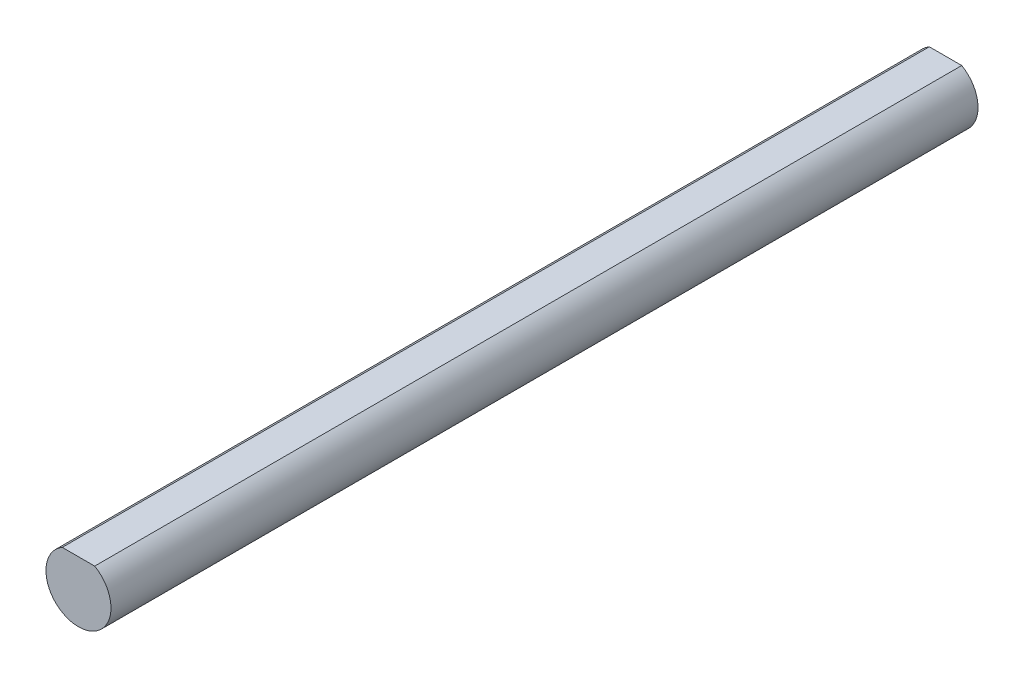
ISO-10303-21;
HEADER;
FILE_DESCRIPTION(('STEP AP214'),'2;1');
FILE_NAME('part.step','',(''),(''),'','','');
FILE_SCHEMA(('AUTOMOTIVE_DESIGN { 1 0 10303 214 1 1 1 1 }'));
ENDSEC;
DATA;
#1=APPLICATION_CONTEXT('core data for automotive mechanical design processes');
#2=APPLICATION_PROTOCOL_DEFINITION('international standard','automotive_design',2000,#1);
#3=PRODUCT_CONTEXT('',#1,'mechanical');
#4=PRODUCT('Part','Part','',(#3));
#5=PRODUCT_RELATED_PRODUCT_CATEGORY('part','',(#4));
#6=PRODUCT_DEFINITION_FORMATION('','',#4);
#7=PRODUCT_DEFINITION_CONTEXT('part definition',#1,'design');
#8=PRODUCT_DEFINITION('design','',#6,#7);
#9=PRODUCT_DEFINITION_SHAPE('','',#8);
#10=(LENGTH_UNIT() NAMED_UNIT(*) SI_UNIT(.MILLI.,.METRE.));
#11=(NAMED_UNIT(*) PLANE_ANGLE_UNIT() SI_UNIT($,.RADIAN.));
#12=(NAMED_UNIT(*) SI_UNIT($,.STERADIAN.) SOLID_ANGLE_UNIT());
#13=UNCERTAINTY_MEASURE_WITH_UNIT(LENGTH_MEASURE(1.E-05),#10,'distance_accuracy_value','');
#14=(GEOMETRIC_REPRESENTATION_CONTEXT(3) GLOBAL_UNCERTAINTY_ASSIGNED_CONTEXT((#13)) GLOBAL_UNIT_ASSIGNED_CONTEXT((#10,
#11,#12)) REPRESENTATION_CONTEXT('',''));
#15=CARTESIAN_POINT('',(0.,0.,0.));
#16=DIRECTION('',(0.,0.,1.));
#17=DIRECTION('',(1.,0.,0.));
#18=AXIS2_PLACEMENT_3D('',#15,#16,#17);
#19=CARTESIAN_POINT('',(0.,0.,-256.));
#20=DIRECTION('',(0.,0.,1.));
#21=DIRECTION('',(1.,0.,0.));
#22=AXIS2_PLACEMENT_3D('',#19,#20,#21);
#23=PLANE('',#22);
#24=CARTESIAN_POINT('',(0.,0.,-256.));
#25=DIRECTION('',(0.,0.,1.));
#26=DIRECTION('',(1.,0.,0.));
#27=AXIS2_PLACEMENT_3D('',#24,#25,#26);
#28=CIRCLE('',#27,7.5);
#29=CARTESIAN_POINT('',(-3.74165738677394,6.5,-256.));
#30=VERTEX_POINT('',#29);
#31=CARTESIAN_POINT('',(3.74165738677394,6.5,-256.));
#32=VERTEX_POINT('',#31);
#33=EDGE_CURVE('E48',#30,#32,#28,.T.);
#34=ORIENTED_EDGE('',*,*,#33,.F.);
#35=DIRECTION('',(1.,0.,0.));
#36=VECTOR('',#35,1.);
#37=CARTESIAN_POINT('',(-10.,6.5,-256.));
#38=LINE('',#37,#36);
#39=EDGE_CURVE('E63',#30,#32,#38,.T.);
#40=ORIENTED_EDGE('',*,*,#39,.T.);
#41=EDGE_LOOP('',(#34,#40));
#42=FACE_BOUND('',#41,.T.);
#43=ADVANCED_FACE('F41',(#42),#23,.F.);
#44=CARTESIAN_POINT('',(0.,0.,-51.));
#45=DIRECTION('',(0.,0.,1.));
#46=DIRECTION('',(1.,0.,0.));
#47=AXIS2_PLACEMENT_3D('',#44,#45,#46);
#48=CYLINDRICAL_SURFACE('',#47,7.5);
#49=ORIENTED_EDGE('',*,*,#33,.T.);
#50=DIRECTION('',(0.,0.,1.));
#51=VECTOR('',#50,1.);
#52=CARTESIAN_POINT('',(3.74165738677394,6.5,-51.));
#53=LINE('',#52,#51);
#54=CARTESIAN_POINT('',(3.74165738677394,6.5,-56.));
#55=VERTEX_POINT('',#54);
#56=EDGE_CURVE('E65',#32,#55,#53,.T.);
#57=ORIENTED_EDGE('',*,*,#56,.T.);
#58=CARTESIAN_POINT('',(0.,0.,-56.));
#59=DIRECTION('',(0.,0.,1.));
#60=DIRECTION('',(1.,0.,0.));
#61=AXIS2_PLACEMENT_3D('',#58,#59,#60);
#62=CIRCLE('',#61,7.5);
#63=CARTESIAN_POINT('',(-3.74165738677394,6.5,-56.));
#64=VERTEX_POINT('',#63);
#65=EDGE_CURVE('E74',#64,#55,#62,.T.);
#66=ORIENTED_EDGE('',*,*,#65,.F.);
#67=DIRECTION('',(0.,0.,1.));
#68=VECTOR('',#67,1.);
#69=CARTESIAN_POINT('',(-3.74165738677394,6.5,-51.));
#70=LINE('',#69,#68);
#71=EDGE_CURVE('E55',#64,#30,#70,.F.);
#72=ORIENTED_EDGE('',*,*,#71,.T.);
#73=EDGE_LOOP('',(#49,#57,#66,#72));
#74=FACE_BOUND('',#73,.T.);
#75=ADVANCED_FACE('F72',(#74),#48,.T.);
#76=CARTESIAN_POINT('',(0.,7.5,-56.));
#77=DIRECTION('',(0.,0.,-1.));
#78=DIRECTION('',(-1.,0.,0.));
#79=AXIS2_PLACEMENT_3D('',#76,#77,#78);
#80=PLANE('',#79);
#81=ORIENTED_EDGE('',*,*,#65,.T.);
#82=DIRECTION('',(-1.,0.,0.));
#83=VECTOR('',#82,1.);
#84=CARTESIAN_POINT('',(0.,6.5,-56.));
#85=LINE('',#84,#83);
#86=EDGE_CURVE('E11',#55,#64,#85,.T.);
#87=ORIENTED_EDGE('',*,*,#86,.T.);
#88=EDGE_LOOP('',(#81,#87));
#89=FACE_BOUND('',#88,.T.);
#90=ADVANCED_FACE('F79',(#89),#80,.F.);
#91=CARTESIAN_POINT('',(-10.,6.5,-256.));
#92=DIRECTION('',(0.,-1.,0.));
#93=DIRECTION('',(0.,0.,-1.));
#94=AXIS2_PLACEMENT_3D('',#91,#92,#93);
#95=PLANE('',#94);
#96=ORIENTED_EDGE('',*,*,#39,.F.);
#97=ORIENTED_EDGE('',*,*,#71,.F.);
#98=ORIENTED_EDGE('',*,*,#86,.F.);
#99=ORIENTED_EDGE('',*,*,#56,.F.);
#100=EDGE_LOOP('',(#96,#97,#98,#99));
#101=FACE_BOUND('',#100,.T.);
#102=ADVANCED_FACE('F64',(#101),#95,.F.);
#103=CLOSED_SHELL('',(#43,#75,#90,#102));
#104=MANIFOLD_SOLID_BREP('B2',#103);
#105=ADVANCED_BREP_SHAPE_REPRESENTATION('',(#18,#104),#14);
#106=SHAPE_DEFINITION_REPRESENTATION(#9,#105);
ENDSEC;
END-ISO-10303-21;
